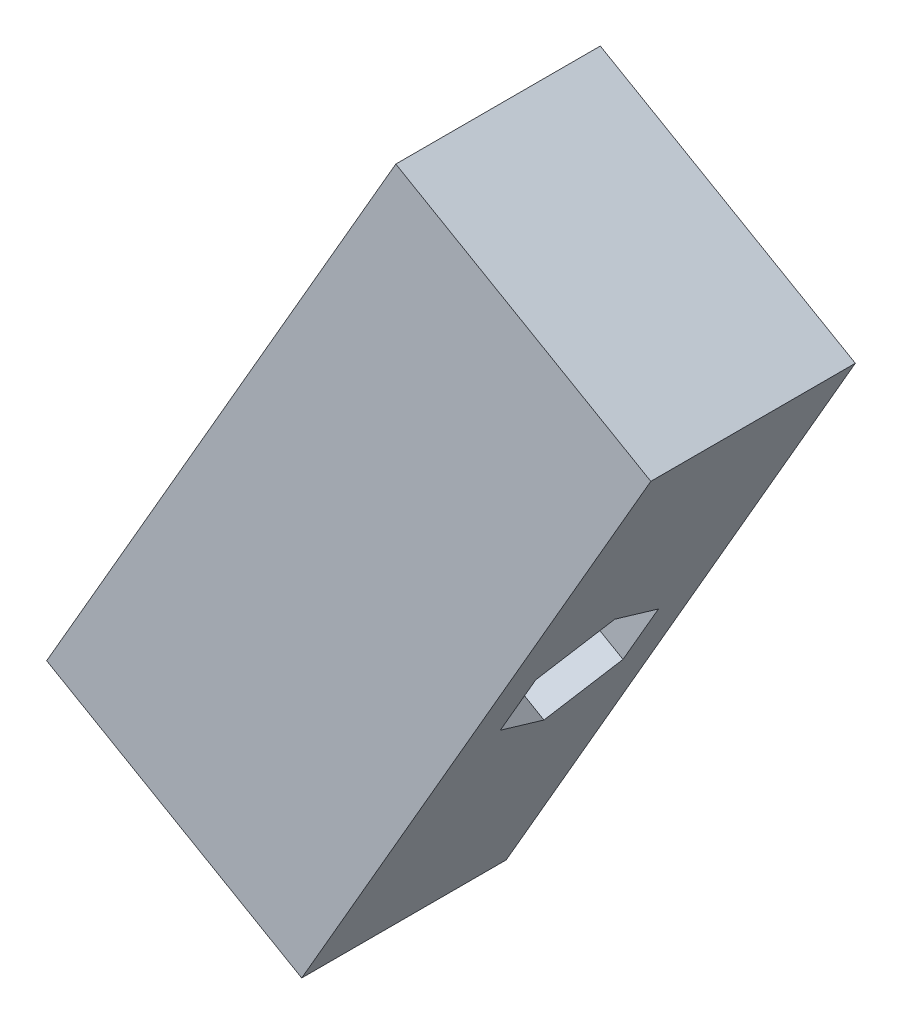
ISO-10303-21;
HEADER;
FILE_DESCRIPTION(('STEP AP214'),'2;1');
FILE_NAME('part.step','',(''),(''),'','','');
FILE_SCHEMA(('AUTOMOTIVE_DESIGN { 1 0 10303 214 1 1 1 1 }'));
ENDSEC;
DATA;
#1=APPLICATION_CONTEXT('core data for automotive mechanical design processes');
#2=APPLICATION_PROTOCOL_DEFINITION('international standard','automotive_design',2000,#1);
#3=PRODUCT_CONTEXT('',#1,'mechanical');
#4=PRODUCT('Part','Part','',(#3));
#5=PRODUCT_RELATED_PRODUCT_CATEGORY('part','',(#4));
#6=PRODUCT_DEFINITION_FORMATION('','',#4);
#7=PRODUCT_DEFINITION_CONTEXT('part definition',#1,'design');
#8=PRODUCT_DEFINITION('design','',#6,#7);
#9=PRODUCT_DEFINITION_SHAPE('','',#8);
#10=(LENGTH_UNIT() NAMED_UNIT(*) SI_UNIT(.MILLI.,.METRE.));
#11=(NAMED_UNIT(*) PLANE_ANGLE_UNIT() SI_UNIT($,.RADIAN.));
#12=(NAMED_UNIT(*) SI_UNIT($,.STERADIAN.) SOLID_ANGLE_UNIT());
#13=UNCERTAINTY_MEASURE_WITH_UNIT(LENGTH_MEASURE(1.E-05),#10,'distance_accuracy_value','');
#14=(GEOMETRIC_REPRESENTATION_CONTEXT(3) GLOBAL_UNCERTAINTY_ASSIGNED_CONTEXT((#13)) GLOBAL_UNIT_ASSIGNED_CONTEXT((#10,
#11,#12)) REPRESENTATION_CONTEXT('',''));
#15=CARTESIAN_POINT('',(0.,0.,0.));
#16=DIRECTION('',(0.,0.,1.));
#17=DIRECTION('',(1.,0.,0.));
#18=AXIS2_PLACEMENT_3D('',#15,#16,#17);
#19=CARTESIAN_POINT('',(-37.3362611347859,1.84279790458007,10.));
#20=DIRECTION('',(-0.866025403784439,0.5,0.));
#21=DIRECTION('',(-0.5,-0.866025403784439,0.));
#22=AXIS2_PLACEMENT_3D('',#19,#20,#21);
#23=PLANE('',#22);
#24=DIRECTION('',(0.5,0.866025403784439,0.));
#25=VECTOR('',#24,1.);
#26=CARTESIAN_POINT('',(-37.3362611347859,1.84279790458007,0.));
#27=LINE('',#26,#25);
#28=CARTESIAN_POINT('',(-37.3362611347859,1.84279790458007,0.));
#29=VERTEX_POINT('',#28);
#30=CARTESIAN_POINT('',(-20.2640403667998,31.4127516727644,0.));
#31=VERTEX_POINT('',#30);
#32=EDGE_CURVE('E177',#29,#31,#27,.T.);
#33=ORIENTED_EDGE('',*,*,#32,.T.);
#34=DIRECTION('',(0.,0.,-1.));
#35=VECTOR('',#34,1.);
#36=CARTESIAN_POINT('',(-20.2640403667998,31.4127516727644,10.));
#37=LINE('',#36,#35);
#38=CARTESIAN_POINT('',(-20.2640403667998,31.4127516727644,10.));
#39=VERTEX_POINT('',#38);
#40=EDGE_CURVE('E48',#39,#31,#37,.T.);
#41=ORIENTED_EDGE('',*,*,#40,.F.);
#42=DIRECTION('',(0.5,0.866025403784439,0.));
#43=VECTOR('',#42,1.);
#44=CARTESIAN_POINT('',(-37.3362611347859,1.84279790458007,10.));
#45=LINE('',#44,#43);
#46=CARTESIAN_POINT('',(-37.3362611347859,1.84279790458007,10.));
#47=VERTEX_POINT('',#46);
#48=EDGE_CURVE('E92',#47,#39,#45,.T.);
#49=ORIENTED_EDGE('',*,*,#48,.F.);
#50=DIRECTION('',(0.,0.,-1.));
#51=VECTOR('',#50,1.);
#52=CARTESIAN_POINT('',(-37.3362611347859,1.84279790458007,10.));
#53=LINE('',#52,#51);
#54=EDGE_CURVE('E11',#47,#29,#53,.T.);
#55=ORIENTED_EDGE('',*,*,#54,.T.);
#56=EDGE_LOOP('',(#33,#41,#49,#55));
#57=FACE_BOUND('',#56,.T.);
#58=DIRECTION('',(0.25,0.43301270189222,-0.866025403784438));
#59=VECTOR('',#58,1.);
#60=CARTESIAN_POINT('',(-30.6975314928725,13.3414149420875,17.6657446916716));
#61=LINE('',#60,#59);
#62=CARTESIAN_POINT('',(-27.9038631189794,18.1801905051687,7.98819356553425));
#63=VERTEX_POINT('',#62);
#64=CARTESIAN_POINT('',(-27.0378377152178,19.6801905051292,4.98819356555125));
#65=VERTEX_POINT('',#64);
#66=EDGE_CURVE('E55',#63,#65,#61,.T.);
#67=ORIENTED_EDGE('',*,*,#66,.T.);
#68=DIRECTION('',(-0.25,-0.43301270189222,-0.866025403784439));
#69=VECTOR('',#68,1.);
#70=CARTESIAN_POINT('',(-28.5273556473391,17.1002697679102,-0.171647908886756));
#71=LINE('',#70,#69);
#72=CARTESIAN_POINT('',(-27.9038631189957,18.1801905051405,1.98819356553426));
#73=VERTEX_POINT('',#72);
#74=EDGE_CURVE('E149',#65,#73,#71,.T.);
#75=ORIENTED_EDGE('',*,*,#74,.T.);
#76=DIRECTION('',(-0.5,-0.866025403784439,0.));
#77=VECTOR('',#76,1.);
#78=CARTESIAN_POINT('',(-37.3362611347859,1.84279790458007,1.98819356553426));
#79=LINE('',#78,#77);
#80=CARTESIAN_POINT('',(-29.6359139266247,15.1801905050364,1.98819356546099));
#81=VERTEX_POINT('',#80);
#82=EDGE_CURVE('E229',#73,#81,#79,.T.);
#83=ORIENTED_EDGE('',*,*,#82,.T.);
#84=DIRECTION('',(-0.25,-0.43301270189222,0.866025403784438));
#85=VECTOR('',#84,1.);
#86=CARTESIAN_POINT('',(-33.2956077042936,8.84141494197016,14.6657446915934));
#87=LINE('',#86,#85);
#88=CARTESIAN_POINT('',(-30.5019393303792,13.6801905050882,4.98819356541291));
#89=VERTEX_POINT('',#88);
#90=EDGE_CURVE('E239',#81,#89,#87,.T.);
#91=ORIENTED_EDGE('',*,*,#90,.T.);
#92=DIRECTION('',(0.25,0.43301270189222,0.866025403784438));
#93=VECTOR('',#92,1.);
#94=CARTESIAN_POINT('',(-31.1254318586802,12.6002697679313,2.82835209109915));
#95=LINE('',#94,#93);
#96=CARTESIAN_POINT('',(-29.6359139265591,15.1801905051499,7.98819356553425));
#97=VERTEX_POINT('',#96);
#98=EDGE_CURVE('E243',#89,#97,#95,.T.);
#99=ORIENTED_EDGE('',*,*,#98,.T.);
#100=DIRECTION('',(0.5,0.866025403784439,0.));
#101=VECTOR('',#100,1.);
#102=CARTESIAN_POINT('',(-37.3362611347859,1.84279790458007,7.98819356553425));
#103=LINE('',#102,#101);
#104=EDGE_CURVE('E145',#97,#63,#103,.T.);
#105=ORIENTED_EDGE('',*,*,#104,.T.);
#106=EDGE_LOOP('',(#67,#75,#83,#91,#99,#105));
#107=FACE_BOUND('',#106,.T.);
#108=ADVANCED_FACE('F39',(#57,#107),#23,.F.);
#109=CARTESIAN_POINT('',(-37.3362611347859,1.84279790458007,10.));
#110=DIRECTION('',(0.5,0.866025403784439,0.));
#111=DIRECTION('',(-0.866025403784439,0.5,0.));
#112=AXIS2_PLACEMENT_3D('',#109,#110,#111);
#113=PLANE('',#112);
#114=DIRECTION('',(0.866025403784439,-0.5,0.));
#115=VECTOR('',#114,1.);
#116=CARTESIAN_POINT('',(-37.3362611347859,1.84279790458007,0.));
#117=LINE('',#116,#115);
#118=CARTESIAN_POINT('',(-49.8070269492816,9.04279790458001,0.));
#119=VERTEX_POINT('',#118);
#120=EDGE_CURVE('E157',#119,#29,#117,.T.);
#121=ORIENTED_EDGE('',*,*,#120,.T.);
#122=ORIENTED_EDGE('',*,*,#54,.F.);
#123=DIRECTION('',(0.866025403784439,-0.5,0.));
#124=VECTOR('',#123,1.);
#125=CARTESIAN_POINT('',(-37.3362611347859,1.84279790458007,10.));
#126=LINE('',#125,#124);
#127=CARTESIAN_POINT('',(-49.8070269492816,9.04279790458001,10.));
#128=VERTEX_POINT('',#127);
#129=EDGE_CURVE('E163',#128,#47,#126,.T.);
#130=ORIENTED_EDGE('',*,*,#129,.F.);
#131=DIRECTION('',(0.,0.,-1.));
#132=VECTOR('',#131,1.);
#133=CARTESIAN_POINT('',(-49.8070269492816,9.04279790458001,10.));
#134=LINE('',#133,#132);
#135=EDGE_CURVE('E173',#128,#119,#134,.T.);
#136=ORIENTED_EDGE('',*,*,#135,.T.);
#137=EDGE_LOOP('',(#121,#122,#130,#136));
#138=FACE_BOUND('',#137,.T.);
#139=ADVANCED_FACE('F41',(#138),#113,.F.);
#140=CARTESIAN_POINT('',(-20.2640403667998,31.4127516727644,10.));
#141=DIRECTION('',(-0.5,-0.866025403784439,0.));
#142=DIRECTION('',(0.866025403784439,-0.5,0.));
#143=AXIS2_PLACEMENT_3D('',#140,#141,#142);
#144=PLANE('',#143);
#145=DIRECTION('',(-0.866025403784439,0.5,0.));
#146=VECTOR('',#145,1.);
#147=CARTESIAN_POINT('',(-20.2640403667998,31.4127516727644,0.));
#148=LINE('',#147,#146);
#149=CARTESIAN_POINT('',(-32.7348061812956,38.6127516727643,0.));
#150=VERTEX_POINT('',#149);
#151=EDGE_CURVE('E180',#31,#150,#148,.T.);
#152=ORIENTED_EDGE('',*,*,#151,.T.);
#153=DIRECTION('',(0.,0.,-1.));
#154=VECTOR('',#153,1.);
#155=CARTESIAN_POINT('',(-32.7348061812956,38.6127516727643,10.));
#156=LINE('',#155,#154);
#157=CARTESIAN_POINT('',(-32.7348061812956,38.6127516727643,10.));
#158=VERTEX_POINT('',#157);
#159=EDGE_CURVE('E187',#158,#150,#156,.T.);
#160=ORIENTED_EDGE('',*,*,#159,.F.);
#161=DIRECTION('',(-0.866025403784439,0.5,0.));
#162=VECTOR('',#161,1.);
#163=CARTESIAN_POINT('',(-20.2640403667998,31.4127516727644,10.));
#164=LINE('',#163,#162);
#165=EDGE_CURVE('E168',#39,#158,#164,.T.);
#166=ORIENTED_EDGE('',*,*,#165,.F.);
#167=ORIENTED_EDGE('',*,*,#40,.T.);
#168=EDGE_LOOP('',(#152,#160,#166,#167));
#169=FACE_BOUND('',#168,.T.);
#170=ADVANCED_FACE('F194',(#169),#144,.F.);
#171=CARTESIAN_POINT('',(-49.8070269492816,9.04279790458001,10.));
#172=DIRECTION('',(0.866025403784439,-0.5,0.));
#173=DIRECTION('',(0.5,0.866025403784439,0.));
#174=AXIS2_PLACEMENT_3D('',#171,#172,#173);
#175=PLANE('',#174);
#176=CARTESIAN_POINT('',(-41.2709165652887,23.827774788672,5.));
#177=DIRECTION('',(-0.866025403784439,0.5,0.));
#178=DIRECTION('',(-0.5,-0.866025403784439,0.));
#179=AXIS2_PLACEMENT_3D('',#176,#177,#178);
#180=CIRCLE('',#179,1.7);
#181=CARTESIAN_POINT('',(-42.1209165652887,22.3555316022385,5.));
#182=VERTEX_POINT('',#181);
#183=EDGE_CURVE('E151',#182,#182,#180,.T.);
#184=ORIENTED_EDGE('',*,*,#183,.F.);
#185=EDGE_LOOP('',(#184));
#186=FACE_BOUND('',#185,.T.);
#187=DIRECTION('',(-0.5,-0.866025403784438,0.));
#188=VECTOR('',#187,1.);
#189=CARTESIAN_POINT('',(-49.8070269492816,9.04279790458001,0.));
#190=LINE('',#189,#188);
#191=EDGE_CURVE('E85',#150,#119,#190,.T.);
#192=ORIENTED_EDGE('',*,*,#191,.T.);
#193=ORIENTED_EDGE('',*,*,#135,.F.);
#194=DIRECTION('',(-0.5,-0.866025403784438,0.));
#195=VECTOR('',#194,1.);
#196=CARTESIAN_POINT('',(-49.8070269492816,9.04279790458001,10.));
#197=LINE('',#196,#195);
#198=EDGE_CURVE('E64',#158,#128,#197,.T.);
#199=ORIENTED_EDGE('',*,*,#198,.F.);
#200=ORIENTED_EDGE('',*,*,#159,.T.);
#201=EDGE_LOOP('',(#192,#193,#199,#200));
#202=FACE_BOUND('',#201,.T.);
#203=ADVANCED_FACE('F202',(#186,#202),#175,.F.);
#204=CARTESIAN_POINT('',(0.,0.,10.));
#205=DIRECTION('',(0.,0.,-1.));
#206=DIRECTION('',(-1.,0.,0.));
#207=AXIS2_PLACEMENT_3D('',#204,#205,#206);
#208=PLANE('',#207);
#209=ORIENTED_EDGE('',*,*,#129,.T.);
#210=ORIENTED_EDGE('',*,*,#48,.T.);
#211=ORIENTED_EDGE('',*,*,#165,.T.);
#212=ORIENTED_EDGE('',*,*,#198,.T.);
#213=EDGE_LOOP('',(#209,#210,#211,#212));
#214=FACE_BOUND('',#213,.T.);
#215=ADVANCED_FACE('F204',(#214),#208,.F.);
#216=CARTESIAN_POINT('',(0.,0.,0.));
#217=DIRECTION('',(0.,0.,-1.));
#218=DIRECTION('',(-1.,0.,0.));
#219=AXIS2_PLACEMENT_3D('',#216,#217,#218);
#220=PLANE('',#219);
#221=ORIENTED_EDGE('',*,*,#120,.F.);
#222=ORIENTED_EDGE('',*,*,#191,.F.);
#223=ORIENTED_EDGE('',*,*,#151,.F.);
#224=ORIENTED_EDGE('',*,*,#32,.F.);
#225=EDGE_LOOP('',(#221,#222,#223,#224));
#226=FACE_BOUND('',#225,.T.);
#227=ADVANCED_FACE('F198',(#226),#220,.T.);
#228=CARTESIAN_POINT('',(-15.9959851748034,9.23528634662601,5.));
#229=DIRECTION('',(-0.866025403784438,0.5,0.));
#230=DIRECTION('',(-0.5,-0.866025403784439,0.));
#231=AXIS2_PLACEMENT_3D('',#228,#229,#230);
#232=CYLINDRICAL_SURFACE('',#231,1.7);
#233=CARTESIAN_POINT('',(-31.3982269620794,18.1277747886738,5.));
#234=DIRECTION('',(-0.866025403784439,0.5,0.));
#235=DIRECTION('',(-0.5,-0.866025403784439,0.));
#236=AXIS2_PLACEMENT_3D('',#233,#234,#235);
#237=CIRCLE('',#236,1.7);
#238=CARTESIAN_POINT('',(-32.2482269620794,16.6555316022403,5.));
#239=VERTEX_POINT('',#238);
#240=EDGE_CURVE('E225',#239,#239,#237,.T.);
#241=ORIENTED_EDGE('',*,*,#240,.F.);
#242=EDGE_LOOP('',(#241));
#243=FACE_BOUND('',#242,.T.);
#244=ORIENTED_EDGE('',*,*,#183,.T.);
#245=EDGE_LOOP('',(#244));
#246=FACE_BOUND('',#245,.T.);
#247=ADVANCED_FACE('F295',(#243,#246),#232,.F.);
#248=CARTESIAN_POINT('',(-31.3982269621462,18.1277747886721,0.));
#249=DIRECTION('',(-0.866025403784439,0.5,0.));
#250=DIRECTION('',(-0.5,-0.866025403784439,0.));
#251=AXIS2_PLACEMENT_3D('',#248,#249,#250);
#252=PLANE('',#251);
#253=DIRECTION('',(0.25,0.43301270189222,-0.866025403784438));
#254=VECTOR('',#253,1.);
#255=CARTESIAN_POINT('',(-33.2956077042258,14.8414149420875,17.6657446916716));
#256=LINE('',#255,#254);
#257=CARTESIAN_POINT('',(-30.5019393303327,19.6801905051687,7.98819356553425));
#258=VERTEX_POINT('',#257);
#259=CARTESIAN_POINT('',(-29.6359139265711,21.1801905051292,4.98819356555125));
#260=VERTEX_POINT('',#259);
#261=EDGE_CURVE('E133',#258,#260,#256,.T.);
#262=ORIENTED_EDGE('',*,*,#261,.F.);
#263=DIRECTION('',(0.5,0.866025403784439,0.));
#264=VECTOR('',#263,1.);
#265=CARTESIAN_POINT('',(-39.9343373461392,3.34279790458008,7.98819356553425));
#266=LINE('',#265,#264);
#267=CARTESIAN_POINT('',(-32.2339901379125,16.6801905051499,7.98819356553425));
#268=VERTEX_POINT('',#267);
#269=EDGE_CURVE('E234',#268,#258,#266,.T.);
#270=ORIENTED_EDGE('',*,*,#269,.F.);
#271=DIRECTION('',(0.25,0.43301270189222,0.866025403784438));
#272=VECTOR('',#271,1.);
#273=CARTESIAN_POINT('',(-33.7235080700335,14.1002697679313,2.82835209109915));
#274=LINE('',#273,#272);
#275=CARTESIAN_POINT('',(-33.1000155417325,15.1801905050882,4.98819356541291));
#276=VERTEX_POINT('',#275);
#277=EDGE_CURVE('E269',#276,#268,#274,.T.);
#278=ORIENTED_EDGE('',*,*,#277,.F.);
#279=DIRECTION('',(-0.25,-0.43301270189222,0.866025403784438));
#280=VECTOR('',#279,1.);
#281=CARTESIAN_POINT('',(-35.8936839156469,10.3414149419702,14.6657446915934));
#282=LINE('',#281,#280);
#283=CARTESIAN_POINT('',(-32.233990137978,16.6801905050364,1.98819356546099));
#284=VERTEX_POINT('',#283);
#285=EDGE_CURVE('E274',#284,#276,#282,.T.);
#286=ORIENTED_EDGE('',*,*,#285,.F.);
#287=DIRECTION('',(-0.5,-0.866025403784439,0.));
#288=VECTOR('',#287,1.);
#289=CARTESIAN_POINT('',(-39.9343373461392,3.34279790458008,1.98819356553426));
#290=LINE('',#289,#288);
#291=CARTESIAN_POINT('',(-30.501939330349,19.6801905051405,1.98819356553426));
#292=VERTEX_POINT('',#291);
#293=EDGE_CURVE('E135',#292,#284,#290,.T.);
#294=ORIENTED_EDGE('',*,*,#293,.F.);
#295=DIRECTION('',(-0.25,-0.43301270189222,-0.866025403784439));
#296=VECTOR('',#295,1.);
#297=CARTESIAN_POINT('',(-31.1254318586924,18.6002697679102,-0.171647908886756));
#298=LINE('',#297,#296);
#299=EDGE_CURVE('E128',#260,#292,#298,.T.);
#300=ORIENTED_EDGE('',*,*,#299,.F.);
#301=EDGE_LOOP('',(#262,#270,#278,#286,#294,#300));
#302=FACE_BOUND('',#301,.T.);
#303=ORIENTED_EDGE('',*,*,#240,.T.);
#304=EDGE_LOOP('',(#303));
#305=FACE_BOUND('',#304,.T.);
#306=ADVANCED_FACE('F130',(#302,#305),#252,.F.);
#307=CARTESIAN_POINT('',(-33.2956077042258,14.8414149420875,17.6657446916716));
#308=DIRECTION('',(-0.433012701892219,-0.75,-0.500000000000001));
#309=DIRECTION('',(0.,0.55470019622523,-0.832050294337843));
#310=AXIS2_PLACEMENT_3D('',#307,#308,#309);
#311=PLANE('',#310);
#312=ORIENTED_EDGE('',*,*,#66,.F.);
#313=DIRECTION('',(0.866025403784439,-0.5,0.));
#314=VECTOR('',#313,1.);
#315=CARTESIAN_POINT('',(-30.5019393303327,19.6801905051687,7.98819356553425));
#316=LINE('',#315,#314);
#317=EDGE_CURVE('E143',#258,#63,#316,.T.);
#318=ORIENTED_EDGE('',*,*,#317,.F.);
#319=ORIENTED_EDGE('',*,*,#261,.T.);
#320=DIRECTION('',(0.866025403784439,-0.5,0.));
#321=VECTOR('',#320,1.);
#322=CARTESIAN_POINT('',(-29.6359139265711,21.1801905051292,4.98819356555125));
#323=LINE('',#322,#321);
#324=EDGE_CURVE('E142',#260,#65,#323,.T.);
#325=ORIENTED_EDGE('',*,*,#324,.T.);
#326=EDGE_LOOP('',(#312,#318,#319,#325));
#327=FACE_BOUND('',#326,.T.);
#328=ADVANCED_FACE('F141',(#327),#311,.T.);
#329=CARTESIAN_POINT('',(-31.1254318586924,18.6002697679102,-0.171647908886756));
#330=DIRECTION('',(-0.433012701892219,-0.75,0.5));
#331=DIRECTION('',(0.,-0.554700196225229,-0.832050294337843));
#332=AXIS2_PLACEMENT_3D('',#329,#330,#331);
#333=PLANE('',#332);
#334=ORIENTED_EDGE('',*,*,#74,.F.);
#335=ORIENTED_EDGE('',*,*,#324,.F.);
#336=ORIENTED_EDGE('',*,*,#299,.T.);
#337=DIRECTION('',(0.866025403784439,-0.5,0.));
#338=VECTOR('',#337,1.);
#339=CARTESIAN_POINT('',(-30.501939330349,19.6801905051405,1.98819356553426));
#340=LINE('',#339,#338);
#341=EDGE_CURVE('E152',#292,#73,#340,.T.);
#342=ORIENTED_EDGE('',*,*,#341,.T.);
#343=EDGE_LOOP('',(#334,#335,#336,#342));
#344=FACE_BOUND('',#343,.T.);
#345=ADVANCED_FACE('F147',(#344),#333,.T.);
#346=CARTESIAN_POINT('',(-39.9343373461392,3.34279790458008,1.98819356553426));
#347=DIRECTION('',(0.,0.,1.));
#348=DIRECTION('',(1.,0.,0.));
#349=AXIS2_PLACEMENT_3D('',#346,#347,#348);
#350=PLANE('',#349);
#351=ORIENTED_EDGE('',*,*,#82,.F.);
#352=ORIENTED_EDGE('',*,*,#341,.F.);
#353=ORIENTED_EDGE('',*,*,#293,.T.);
#354=DIRECTION('',(0.866025403784439,-0.5,0.));
#355=VECTOR('',#354,1.);
#356=CARTESIAN_POINT('',(-32.233990137978,16.6801905050364,1.98819356546099));
#357=LINE('',#356,#355);
#358=EDGE_CURVE('E159',#284,#81,#357,.T.);
#359=ORIENTED_EDGE('',*,*,#358,.T.);
#360=EDGE_LOOP('',(#351,#352,#353,#359));
#361=FACE_BOUND('',#360,.T.);
#362=ADVANCED_FACE('F260',(#361),#350,.T.);
#363=CARTESIAN_POINT('',(-35.8936839156469,10.3414149419702,14.6657446915934));
#364=DIRECTION('',(0.433012701892219,0.749999999999999,0.500000000000001));
#365=DIRECTION('',(0.,-0.55470019622523,0.832050294337843));
#366=AXIS2_PLACEMENT_3D('',#363,#364,#365);
#367=PLANE('',#366);
#368=ORIENTED_EDGE('',*,*,#90,.F.);
#369=ORIENTED_EDGE('',*,*,#358,.F.);
#370=ORIENTED_EDGE('',*,*,#285,.T.);
#371=DIRECTION('',(0.866025403784439,-0.5,0.));
#372=VECTOR('',#371,1.);
#373=CARTESIAN_POINT('',(-33.1000155417325,15.1801905050882,4.98819356541291));
#374=LINE('',#373,#372);
#375=EDGE_CURVE('E253',#276,#89,#374,.T.);
#376=ORIENTED_EDGE('',*,*,#375,.T.);
#377=EDGE_LOOP('',(#368,#369,#370,#376));
#378=FACE_BOUND('',#377,.T.);
#379=ADVANCED_FACE('F262',(#378),#367,.T.);
#380=CARTESIAN_POINT('',(-33.7235080700335,14.1002697679313,2.82835209109915));
#381=DIRECTION('',(0.433012701892219,0.75,-0.500000000000001));
#382=DIRECTION('',(0.,0.55470019622523,0.832050294337843));
#383=AXIS2_PLACEMENT_3D('',#380,#381,#382);
#384=PLANE('',#383);
#385=ORIENTED_EDGE('',*,*,#98,.F.);
#386=ORIENTED_EDGE('',*,*,#375,.F.);
#387=ORIENTED_EDGE('',*,*,#277,.T.);
#388=DIRECTION('',(0.866025403784439,-0.5,0.));
#389=VECTOR('',#388,1.);
#390=CARTESIAN_POINT('',(-32.2339901379125,16.6801905051499,7.98819356553425));
#391=LINE('',#390,#389);
#392=EDGE_CURVE('E250',#268,#97,#391,.T.);
#393=ORIENTED_EDGE('',*,*,#392,.T.);
#394=EDGE_LOOP('',(#385,#386,#387,#393));
#395=FACE_BOUND('',#394,.T.);
#396=ADVANCED_FACE('F266',(#395),#384,.T.);
#397=CARTESIAN_POINT('',(-39.9343373461392,3.34279790458008,7.98819356553425));
#398=DIRECTION('',(0.,0.,-1.));
#399=DIRECTION('',(-1.,0.,0.));
#400=AXIS2_PLACEMENT_3D('',#397,#398,#399);
#401=PLANE('',#400);
#402=ORIENTED_EDGE('',*,*,#104,.F.);
#403=ORIENTED_EDGE('',*,*,#392,.F.);
#404=ORIENTED_EDGE('',*,*,#269,.T.);
#405=ORIENTED_EDGE('',*,*,#317,.T.);
#406=EDGE_LOOP('',(#402,#403,#404,#405));
#407=FACE_BOUND('',#406,.T.);
#408=ADVANCED_FACE('F271',(#407),#401,.T.);
#409=CLOSED_SHELL('',(#108,#139,#170,#203,#215,#227,#247,#306,#328,#345,#362,#379,#396,#408));
#410=MANIFOLD_SOLID_BREP('B2',#409);
#411=ADVANCED_BREP_SHAPE_REPRESENTATION('',(#18,#410),#14);
#412=SHAPE_DEFINITION_REPRESENTATION(#9,#411);
ENDSEC;
END-ISO-10303-21;
